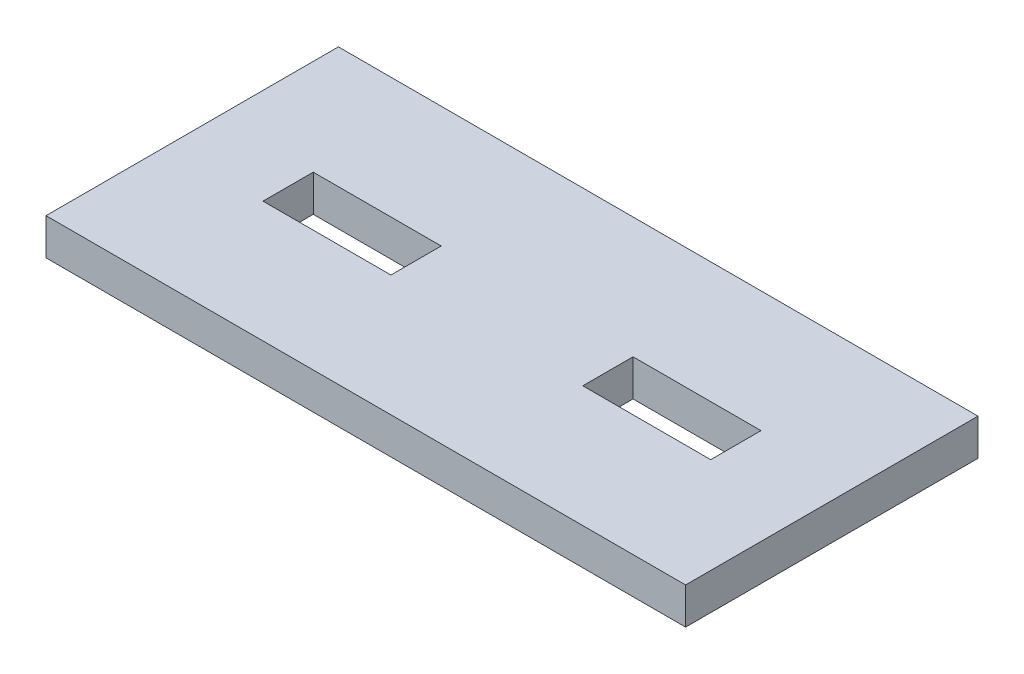
ISO-10303-21;
HEADER;
FILE_DESCRIPTION(('STEP AP214'),'2;1');
FILE_NAME('part.step','',(''),(''),'','','');
FILE_SCHEMA(('AUTOMOTIVE_DESIGN { 1 0 10303 214 1 1 1 1 }'));
ENDSEC;
DATA;
#1=APPLICATION_CONTEXT('core data for automotive mechanical design processes');
#2=APPLICATION_PROTOCOL_DEFINITION('international standard','automotive_design',2000,#1);
#3=PRODUCT_CONTEXT('',#1,'mechanical');
#4=PRODUCT('Part','Part','',(#3));
#5=PRODUCT_RELATED_PRODUCT_CATEGORY('part','',(#4));
#6=PRODUCT_DEFINITION_FORMATION('','',#4);
#7=PRODUCT_DEFINITION_CONTEXT('part definition',#1,'design');
#8=PRODUCT_DEFINITION('design','',#6,#7);
#9=PRODUCT_DEFINITION_SHAPE('','',#8);
#10=(LENGTH_UNIT() NAMED_UNIT(*) SI_UNIT(.MILLI.,.METRE.));
#11=(NAMED_UNIT(*) PLANE_ANGLE_UNIT() SI_UNIT($,.RADIAN.));
#12=(NAMED_UNIT(*) SI_UNIT($,.STERADIAN.) SOLID_ANGLE_UNIT());
#13=UNCERTAINTY_MEASURE_WITH_UNIT(LENGTH_MEASURE(1.E-05),#10,'distance_accuracy_value','');
#14=(GEOMETRIC_REPRESENTATION_CONTEXT(3) GLOBAL_UNCERTAINTY_ASSIGNED_CONTEXT((#13)) GLOBAL_UNIT_ASSIGNED_CONTEXT((#10,
#11,#12)) REPRESENTATION_CONTEXT('',''));
#15=CARTESIAN_POINT('',(0.,0.,0.));
#16=DIRECTION('',(0.,0.,1.));
#17=DIRECTION('',(1.,0.,0.));
#18=AXIS2_PLACEMENT_3D('',#15,#16,#17);
#19=CARTESIAN_POINT('',(0.,4.,0.));
#20=DIRECTION('',(0.,-1.,0.));
#21=DIRECTION('',(0.,0.,-1.));
#22=AXIS2_PLACEMENT_3D('',#19,#20,#21);
#23=PLANE('',#22);
#24=DIRECTION('',(0.,0.,1.));
#25=VECTOR('',#24,1.);
#26=CARTESIAN_POINT('',(-24.5,4.,2.75));
#27=LINE('',#26,#25);
#28=CARTESIAN_POINT('',(-24.5,4.,-2.75));
#29=VERTEX_POINT('',#28);
#30=CARTESIAN_POINT('',(-24.5,4.,2.75));
#31=VERTEX_POINT('',#30);
#32=EDGE_CURVE('E163',#29,#31,#27,.T.);
#33=ORIENTED_EDGE('',*,*,#32,.F.);
#34=DIRECTION('',(-1.,0.,0.));
#35=VECTOR('',#34,1.);
#36=CARTESIAN_POINT('',(-24.5,4.,-2.75));
#37=LINE('',#36,#35);
#38=CARTESIAN_POINT('',(-10.5,4.,-2.75));
#39=VERTEX_POINT('',#38);
#40=EDGE_CURVE('E175',#39,#29,#37,.T.);
#41=ORIENTED_EDGE('',*,*,#40,.F.);
#42=DIRECTION('',(0.,0.,-1.));
#43=VECTOR('',#42,1.);
#44=CARTESIAN_POINT('',(-10.5,4.,2.75));
#45=LINE('',#44,#43);
#46=CARTESIAN_POINT('',(-10.5,4.,2.75));
#47=VERTEX_POINT('',#46);
#48=EDGE_CURVE('E170',#47,#39,#45,.T.);
#49=ORIENTED_EDGE('',*,*,#48,.F.);
#50=DIRECTION('',(1.,0.,0.));
#51=VECTOR('',#50,1.);
#52=CARTESIAN_POINT('',(-24.5,4.,2.75));
#53=LINE('',#52,#51);
#54=EDGE_CURVE('E168',#31,#47,#53,.T.);
#55=ORIENTED_EDGE('',*,*,#54,.F.);
#56=EDGE_LOOP('',(#33,#41,#49,#55));
#57=FACE_BOUND('',#56,.T.);
#58=DIRECTION('',(0.,0.,1.));
#59=VECTOR('',#58,1.);
#60=CARTESIAN_POINT('',(-35.,4.,16.));
#61=LINE('',#60,#59);
#62=CARTESIAN_POINT('',(-35.,4.,-16.));
#63=VERTEX_POINT('',#62);
#64=CARTESIAN_POINT('',(-35.,4.,16.));
#65=VERTEX_POINT('',#64);
#66=EDGE_CURVE('E193',#63,#65,#61,.T.);
#67=ORIENTED_EDGE('',*,*,#66,.T.);
#68=DIRECTION('',(1.,0.,0.));
#69=VECTOR('',#68,1.);
#70=CARTESIAN_POINT('',(-35.,4.,16.));
#71=LINE('',#70,#69);
#72=CARTESIAN_POINT('',(35.,4.,16.));
#73=VERTEX_POINT('',#72);
#74=EDGE_CURVE('E199',#65,#73,#71,.T.);
#75=ORIENTED_EDGE('',*,*,#74,.T.);
#76=DIRECTION('',(0.,0.,-1.));
#77=VECTOR('',#76,1.);
#78=CARTESIAN_POINT('',(35.,4.,16.));
#79=LINE('',#78,#77);
#80=CARTESIAN_POINT('',(35.,4.,-16.));
#81=VERTEX_POINT('',#80);
#82=EDGE_CURVE('E202',#73,#81,#79,.T.);
#83=ORIENTED_EDGE('',*,*,#82,.T.);
#84=DIRECTION('',(-1.,0.,0.));
#85=VECTOR('',#84,1.);
#86=CARTESIAN_POINT('',(-35.,4.,-16.));
#87=LINE('',#86,#85);
#88=EDGE_CURVE('E201',#81,#63,#87,.T.);
#89=ORIENTED_EDGE('',*,*,#88,.T.);
#90=EDGE_LOOP('',(#67,#75,#83,#89));
#91=FACE_BOUND('',#90,.T.);
#92=DIRECTION('',(0.,0.,1.));
#93=VECTOR('',#92,1.);
#94=CARTESIAN_POINT('',(10.5,4.,2.75));
#95=LINE('',#94,#93);
#96=CARTESIAN_POINT('',(10.5,4.,-2.75));
#97=VERTEX_POINT('',#96);
#98=CARTESIAN_POINT('',(10.5,4.,2.75));
#99=VERTEX_POINT('',#98);
#100=EDGE_CURVE('E126',#97,#99,#95,.T.);
#101=ORIENTED_EDGE('',*,*,#100,.F.);
#102=DIRECTION('',(-1.,0.,0.));
#103=VECTOR('',#102,1.);
#104=CARTESIAN_POINT('',(10.5,4.,-2.75));
#105=LINE('',#104,#103);
#106=CARTESIAN_POINT('',(24.5,4.,-2.75));
#107=VERTEX_POINT('',#106);
#108=EDGE_CURVE('E148',#107,#97,#105,.T.);
#109=ORIENTED_EDGE('',*,*,#108,.F.);
#110=DIRECTION('',(0.,0.,-1.));
#111=VECTOR('',#110,1.);
#112=CARTESIAN_POINT('',(24.5,4.,2.75));
#113=LINE('',#112,#111);
#114=CARTESIAN_POINT('',(24.5,4.,2.75));
#115=VERTEX_POINT('',#114);
#116=EDGE_CURVE('E149',#115,#107,#113,.T.);
#117=ORIENTED_EDGE('',*,*,#116,.F.);
#118=DIRECTION('',(1.,0.,0.));
#119=VECTOR('',#118,1.);
#120=CARTESIAN_POINT('',(10.5,4.,2.75));
#121=LINE('',#120,#119);
#122=EDGE_CURVE('E136',#99,#115,#121,.T.);
#123=ORIENTED_EDGE('',*,*,#122,.F.);
#124=EDGE_LOOP('',(#101,#109,#117,#123));
#125=FACE_BOUND('',#124,.T.);
#126=ADVANCED_FACE('F39',(#57,#91,#125),#23,.F.);
#127=CARTESIAN_POINT('',(0.,0.,0.));
#128=DIRECTION('',(0.,-1.,0.));
#129=DIRECTION('',(0.,0.,-1.));
#130=AXIS2_PLACEMENT_3D('',#127,#128,#129);
#131=PLANE('',#130);
#132=DIRECTION('',(0.,0.,1.));
#133=VECTOR('',#132,1.);
#134=CARTESIAN_POINT('',(-35.,0.,16.));
#135=LINE('',#134,#133);
#136=CARTESIAN_POINT('',(-35.,0.,-16.));
#137=VERTEX_POINT('',#136);
#138=CARTESIAN_POINT('',(-35.,0.,16.));
#139=VERTEX_POINT('',#138);
#140=EDGE_CURVE('E191',#137,#139,#135,.T.);
#141=ORIENTED_EDGE('',*,*,#140,.F.);
#142=DIRECTION('',(-1.,0.,0.));
#143=VECTOR('',#142,1.);
#144=CARTESIAN_POINT('',(-35.,0.,-16.));
#145=LINE('',#144,#143);
#146=CARTESIAN_POINT('',(35.,0.,-16.));
#147=VERTEX_POINT('',#146);
#148=EDGE_CURVE('E198',#147,#137,#145,.T.);
#149=ORIENTED_EDGE('',*,*,#148,.F.);
#150=DIRECTION('',(0.,0.,-1.));
#151=VECTOR('',#150,1.);
#152=CARTESIAN_POINT('',(35.,0.,16.));
#153=LINE('',#152,#151);
#154=CARTESIAN_POINT('',(35.,0.,16.));
#155=VERTEX_POINT('',#154);
#156=EDGE_CURVE('E210',#155,#147,#153,.T.);
#157=ORIENTED_EDGE('',*,*,#156,.F.);
#158=DIRECTION('',(1.,0.,0.));
#159=VECTOR('',#158,1.);
#160=CARTESIAN_POINT('',(-35.,0.,16.));
#161=LINE('',#160,#159);
#162=EDGE_CURVE('E209',#139,#155,#161,.T.);
#163=ORIENTED_EDGE('',*,*,#162,.F.);
#164=EDGE_LOOP('',(#141,#149,#157,#163));
#165=FACE_BOUND('',#164,.T.);
#166=DIRECTION('',(-1.,0.,0.));
#167=VECTOR('',#166,1.);
#168=CARTESIAN_POINT('',(-24.5,0.,-2.75));
#169=LINE('',#168,#167);
#170=CARTESIAN_POINT('',(-10.5,0.,-2.75));
#171=VERTEX_POINT('',#170);
#172=CARTESIAN_POINT('',(-24.5,0.,-2.75));
#173=VERTEX_POINT('',#172);
#174=EDGE_CURVE('E167',#171,#173,#169,.T.);
#175=ORIENTED_EDGE('',*,*,#174,.T.);
#176=DIRECTION('',(0.,0.,1.));
#177=VECTOR('',#176,1.);
#178=CARTESIAN_POINT('',(-24.5,0.,2.75));
#179=LINE('',#178,#177);
#180=CARTESIAN_POINT('',(-24.5,0.,2.75));
#181=VERTEX_POINT('',#180);
#182=EDGE_CURVE('E143',#173,#181,#179,.T.);
#183=ORIENTED_EDGE('',*,*,#182,.T.);
#184=DIRECTION('',(1.,0.,0.));
#185=VECTOR('',#184,1.);
#186=CARTESIAN_POINT('',(-24.5,0.,2.75));
#187=LINE('',#186,#185);
#188=CARTESIAN_POINT('',(-10.5,0.,2.75));
#189=VERTEX_POINT('',#188);
#190=EDGE_CURVE('E180',#181,#189,#187,.T.);
#191=ORIENTED_EDGE('',*,*,#190,.T.);
#192=DIRECTION('',(0.,0.,-1.));
#193=VECTOR('',#192,1.);
#194=CARTESIAN_POINT('',(-10.5,0.,2.75));
#195=LINE('',#194,#193);
#196=EDGE_CURVE('E179',#189,#171,#195,.T.);
#197=ORIENTED_EDGE('',*,*,#196,.T.);
#198=EDGE_LOOP('',(#175,#183,#191,#197));
#199=FACE_BOUND('',#198,.T.);
#200=DIRECTION('',(-1.,0.,0.));
#201=VECTOR('',#200,1.);
#202=CARTESIAN_POINT('',(10.5,0.,-2.75));
#203=LINE('',#202,#201);
#204=CARTESIAN_POINT('',(24.5,0.,-2.75));
#205=VERTEX_POINT('',#204);
#206=CARTESIAN_POINT('',(10.5,0.,-2.75));
#207=VERTEX_POINT('',#206);
#208=EDGE_CURVE('E140',#205,#207,#203,.T.);
#209=ORIENTED_EDGE('',*,*,#208,.T.);
#210=DIRECTION('',(0.,0.,1.));
#211=VECTOR('',#210,1.);
#212=CARTESIAN_POINT('',(10.5,0.,2.75));
#213=LINE('',#212,#211);
#214=CARTESIAN_POINT('',(10.5,0.,2.75));
#215=VERTEX_POINT('',#214);
#216=EDGE_CURVE('E62',#207,#215,#213,.T.);
#217=ORIENTED_EDGE('',*,*,#216,.T.);
#218=DIRECTION('',(1.,0.,0.));
#219=VECTOR('',#218,1.);
#220=CARTESIAN_POINT('',(10.5,0.,2.75));
#221=LINE('',#220,#219);
#222=CARTESIAN_POINT('',(24.5,0.,2.75));
#223=VERTEX_POINT('',#222);
#224=EDGE_CURVE('E142',#215,#223,#221,.T.);
#225=ORIENTED_EDGE('',*,*,#224,.T.);
#226=DIRECTION('',(0.,0.,-1.));
#227=VECTOR('',#226,1.);
#228=CARTESIAN_POINT('',(24.5,0.,2.75));
#229=LINE('',#228,#227);
#230=EDGE_CURVE('E157',#223,#205,#229,.T.);
#231=ORIENTED_EDGE('',*,*,#230,.T.);
#232=EDGE_LOOP('',(#209,#217,#225,#231));
#233=FACE_BOUND('',#232,.T.);
#234=ADVANCED_FACE('F228',(#165,#199,#233),#131,.T.);
#235=CARTESIAN_POINT('',(-35.,4.,16.));
#236=DIRECTION('',(1.,0.,0.));
#237=DIRECTION('',(0.,0.,-1.));
#238=AXIS2_PLACEMENT_3D('',#235,#236,#237);
#239=PLANE('',#238);
#240=ORIENTED_EDGE('',*,*,#140,.T.);
#241=DIRECTION('',(0.,-1.,0.));
#242=VECTOR('',#241,1.);
#243=CARTESIAN_POINT('',(-35.,4.,16.));
#244=LINE('',#243,#242);
#245=EDGE_CURVE('E11',#65,#139,#244,.T.);
#246=ORIENTED_EDGE('',*,*,#245,.F.);
#247=ORIENTED_EDGE('',*,*,#66,.F.);
#248=DIRECTION('',(0.,-1.,0.));
#249=VECTOR('',#248,1.);
#250=CARTESIAN_POINT('',(-35.,4.,-16.));
#251=LINE('',#250,#249);
#252=EDGE_CURVE('E203',#63,#137,#251,.T.);
#253=ORIENTED_EDGE('',*,*,#252,.T.);
#254=EDGE_LOOP('',(#240,#246,#247,#253));
#255=FACE_BOUND('',#254,.T.);
#256=ADVANCED_FACE('F41',(#255),#239,.F.);
#257=CARTESIAN_POINT('',(-35.,4.,16.));
#258=DIRECTION('',(0.,0.,-1.));
#259=DIRECTION('',(-1.,0.,0.));
#260=AXIS2_PLACEMENT_3D('',#257,#258,#259);
#261=PLANE('',#260);
#262=ORIENTED_EDGE('',*,*,#162,.T.);
#263=DIRECTION('',(0.,-1.,0.));
#264=VECTOR('',#263,1.);
#265=CARTESIAN_POINT('',(35.,4.,16.));
#266=LINE('',#265,#264);
#267=EDGE_CURVE('E50',#73,#155,#266,.T.);
#268=ORIENTED_EDGE('',*,*,#267,.F.);
#269=ORIENTED_EDGE('',*,*,#74,.F.);
#270=ORIENTED_EDGE('',*,*,#245,.T.);
#271=EDGE_LOOP('',(#262,#268,#269,#270));
#272=FACE_BOUND('',#271,.T.);
#273=ADVANCED_FACE('F239',(#272),#261,.F.);
#274=CARTESIAN_POINT('',(35.,4.,16.));
#275=DIRECTION('',(-1.,0.,0.));
#276=DIRECTION('',(0.,0.,1.));
#277=AXIS2_PLACEMENT_3D('',#274,#275,#276);
#278=PLANE('',#277);
#279=ORIENTED_EDGE('',*,*,#156,.T.);
#280=DIRECTION('',(0.,-1.,0.));
#281=VECTOR('',#280,1.);
#282=CARTESIAN_POINT('',(35.,4.,-16.));
#283=LINE('',#282,#281);
#284=EDGE_CURVE('E214',#81,#147,#283,.T.);
#285=ORIENTED_EDGE('',*,*,#284,.F.);
#286=ORIENTED_EDGE('',*,*,#82,.F.);
#287=ORIENTED_EDGE('',*,*,#267,.T.);
#288=EDGE_LOOP('',(#279,#285,#286,#287));
#289=FACE_BOUND('',#288,.T.);
#290=ADVANCED_FACE('F225',(#289),#278,.F.);
#291=CARTESIAN_POINT('',(-35.,4.,-16.));
#292=DIRECTION('',(0.,0.,1.));
#293=DIRECTION('',(1.,0.,0.));
#294=AXIS2_PLACEMENT_3D('',#291,#292,#293);
#295=PLANE('',#294);
#296=ORIENTED_EDGE('',*,*,#148,.T.);
#297=ORIENTED_EDGE('',*,*,#252,.F.);
#298=ORIENTED_EDGE('',*,*,#88,.F.);
#299=ORIENTED_EDGE('',*,*,#284,.T.);
#300=EDGE_LOOP('',(#296,#297,#298,#299));
#301=FACE_BOUND('',#300,.T.);
#302=ADVANCED_FACE('F235',(#301),#295,.F.);
#303=CARTESIAN_POINT('',(-24.5,4.,2.75));
#304=DIRECTION('',(1.,0.,0.));
#305=DIRECTION('',(0.,0.,-1.));
#306=AXIS2_PLACEMENT_3D('',#303,#304,#305);
#307=PLANE('',#306);
#308=ORIENTED_EDGE('',*,*,#182,.F.);
#309=DIRECTION('',(0.,-1.,0.));
#310=VECTOR('',#309,1.);
#311=CARTESIAN_POINT('',(-24.5,4.,-2.75));
#312=LINE('',#311,#310);
#313=EDGE_CURVE('E174',#29,#173,#312,.T.);
#314=ORIENTED_EDGE('',*,*,#313,.F.);
#315=ORIENTED_EDGE('',*,*,#32,.T.);
#316=DIRECTION('',(0.,-1.,0.));
#317=VECTOR('',#316,1.);
#318=CARTESIAN_POINT('',(-24.5,4.,2.75));
#319=LINE('',#318,#317);
#320=EDGE_CURVE('E192',#31,#181,#319,.T.);
#321=ORIENTED_EDGE('',*,*,#320,.T.);
#322=EDGE_LOOP('',(#308,#314,#315,#321));
#323=FACE_BOUND('',#322,.T.);
#324=ADVANCED_FACE('F253',(#323),#307,.T.);
#325=CARTESIAN_POINT('',(-24.5,4.,2.75));
#326=DIRECTION('',(0.,0.,-1.));
#327=DIRECTION('',(-1.,0.,0.));
#328=AXIS2_PLACEMENT_3D('',#325,#326,#327);
#329=PLANE('',#328);
#330=ORIENTED_EDGE('',*,*,#190,.F.);
#331=ORIENTED_EDGE('',*,*,#320,.F.);
#332=ORIENTED_EDGE('',*,*,#54,.T.);
#333=DIRECTION('',(0.,-1.,0.));
#334=VECTOR('',#333,1.);
#335=CARTESIAN_POINT('',(-10.5,4.,2.75));
#336=LINE('',#335,#334);
#337=EDGE_CURVE('E188',#47,#189,#336,.T.);
#338=ORIENTED_EDGE('',*,*,#337,.T.);
#339=EDGE_LOOP('',(#330,#331,#332,#338));
#340=FACE_BOUND('',#339,.T.);
#341=ADVANCED_FACE('F263',(#340),#329,.T.);
#342=CARTESIAN_POINT('',(-10.5,4.,2.75));
#343=DIRECTION('',(-1.,0.,0.));
#344=DIRECTION('',(0.,0.,1.));
#345=AXIS2_PLACEMENT_3D('',#342,#343,#344);
#346=PLANE('',#345);
#347=ORIENTED_EDGE('',*,*,#196,.F.);
#348=ORIENTED_EDGE('',*,*,#337,.F.);
#349=ORIENTED_EDGE('',*,*,#48,.T.);
#350=DIRECTION('',(0.,-1.,0.));
#351=VECTOR('',#350,1.);
#352=CARTESIAN_POINT('',(-10.5,4.,-2.75));
#353=LINE('',#352,#351);
#354=EDGE_CURVE('E190',#39,#171,#353,.T.);
#355=ORIENTED_EDGE('',*,*,#354,.T.);
#356=EDGE_LOOP('',(#347,#348,#349,#355));
#357=FACE_BOUND('',#356,.T.);
#358=ADVANCED_FACE('F266',(#357),#346,.T.);
#359=CARTESIAN_POINT('',(-24.5,4.,-2.75));
#360=DIRECTION('',(0.,0.,1.));
#361=DIRECTION('',(1.,0.,0.));
#362=AXIS2_PLACEMENT_3D('',#359,#360,#361);
#363=PLANE('',#362);
#364=ORIENTED_EDGE('',*,*,#174,.F.);
#365=ORIENTED_EDGE('',*,*,#354,.F.);
#366=ORIENTED_EDGE('',*,*,#40,.T.);
#367=ORIENTED_EDGE('',*,*,#313,.T.);
#368=EDGE_LOOP('',(#364,#365,#366,#367));
#369=FACE_BOUND('',#368,.T.);
#370=ADVANCED_FACE('F275',(#369),#363,.T.);
#371=CARTESIAN_POINT('',(10.5,4.,2.75));
#372=DIRECTION('',(1.,0.,0.));
#373=DIRECTION('',(0.,0.,-1.));
#374=AXIS2_PLACEMENT_3D('',#371,#372,#373);
#375=PLANE('',#374);
#376=ORIENTED_EDGE('',*,*,#216,.F.);
#377=DIRECTION('',(0.,-1.,0.));
#378=VECTOR('',#377,1.);
#379=CARTESIAN_POINT('',(10.5,4.,-2.75));
#380=LINE('',#379,#378);
#381=EDGE_CURVE('E135',#97,#207,#380,.T.);
#382=ORIENTED_EDGE('',*,*,#381,.F.);
#383=ORIENTED_EDGE('',*,*,#100,.T.);
#384=DIRECTION('',(0.,-1.,0.));
#385=VECTOR('',#384,1.);
#386=CARTESIAN_POINT('',(10.5,4.,2.75));
#387=LINE('',#386,#385);
#388=EDGE_CURVE('E131',#99,#215,#387,.T.);
#389=ORIENTED_EDGE('',*,*,#388,.T.);
#390=EDGE_LOOP('',(#376,#382,#383,#389));
#391=FACE_BOUND('',#390,.T.);
#392=ADVANCED_FACE('F127',(#391),#375,.T.);
#393=CARTESIAN_POINT('',(10.5,4.,2.75));
#394=DIRECTION('',(0.,0.,-1.));
#395=DIRECTION('',(-1.,0.,0.));
#396=AXIS2_PLACEMENT_3D('',#393,#394,#395);
#397=PLANE('',#396);
#398=ORIENTED_EDGE('',*,*,#224,.F.);
#399=ORIENTED_EDGE('',*,*,#388,.F.);
#400=ORIENTED_EDGE('',*,*,#122,.T.);
#401=DIRECTION('',(0.,-1.,0.));
#402=VECTOR('',#401,1.);
#403=CARTESIAN_POINT('',(24.5,4.,2.75));
#404=LINE('',#403,#402);
#405=EDGE_CURVE('E144',#115,#223,#404,.T.);
#406=ORIENTED_EDGE('',*,*,#405,.T.);
#407=EDGE_LOOP('',(#398,#399,#400,#406));
#408=FACE_BOUND('',#407,.T.);
#409=ADVANCED_FACE('F139',(#408),#397,.T.);
#410=CARTESIAN_POINT('',(24.5,4.,2.75));
#411=DIRECTION('',(-1.,0.,0.));
#412=DIRECTION('',(0.,0.,1.));
#413=AXIS2_PLACEMENT_3D('',#410,#411,#412);
#414=PLANE('',#413);
#415=ORIENTED_EDGE('',*,*,#230,.F.);
#416=ORIENTED_EDGE('',*,*,#405,.F.);
#417=ORIENTED_EDGE('',*,*,#116,.T.);
#418=DIRECTION('',(0.,-1.,0.));
#419=VECTOR('',#418,1.);
#420=CARTESIAN_POINT('',(24.5,4.,-2.75));
#421=LINE('',#420,#419);
#422=EDGE_CURVE('E53',#107,#205,#421,.T.);
#423=ORIENTED_EDGE('',*,*,#422,.T.);
#424=EDGE_LOOP('',(#415,#416,#417,#423));
#425=FACE_BOUND('',#424,.T.);
#426=ADVANCED_FACE('F292',(#425),#414,.T.);
#427=CARTESIAN_POINT('',(10.5,4.,-2.75));
#428=DIRECTION('',(0.,0.,1.));
#429=DIRECTION('',(1.,0.,0.));
#430=AXIS2_PLACEMENT_3D('',#427,#428,#429);
#431=PLANE('',#430);
#432=ORIENTED_EDGE('',*,*,#208,.F.);
#433=ORIENTED_EDGE('',*,*,#422,.F.);
#434=ORIENTED_EDGE('',*,*,#108,.T.);
#435=ORIENTED_EDGE('',*,*,#381,.T.);
#436=EDGE_LOOP('',(#432,#433,#434,#435));
#437=FACE_BOUND('',#436,.T.);
#438=ADVANCED_FACE('F294',(#437),#431,.T.);
#439=CLOSED_SHELL('',(#126,#234,#256,#273,#290,#302,#324,#341,#358,#370,#392,#409,#426,#438));
#440=MANIFOLD_SOLID_BREP('B2',#439);
#441=ADVANCED_BREP_SHAPE_REPRESENTATION('',(#18,#440),#14);
#442=SHAPE_DEFINITION_REPRESENTATION(#9,#441);
ENDSEC;
END-ISO-10303-21;
